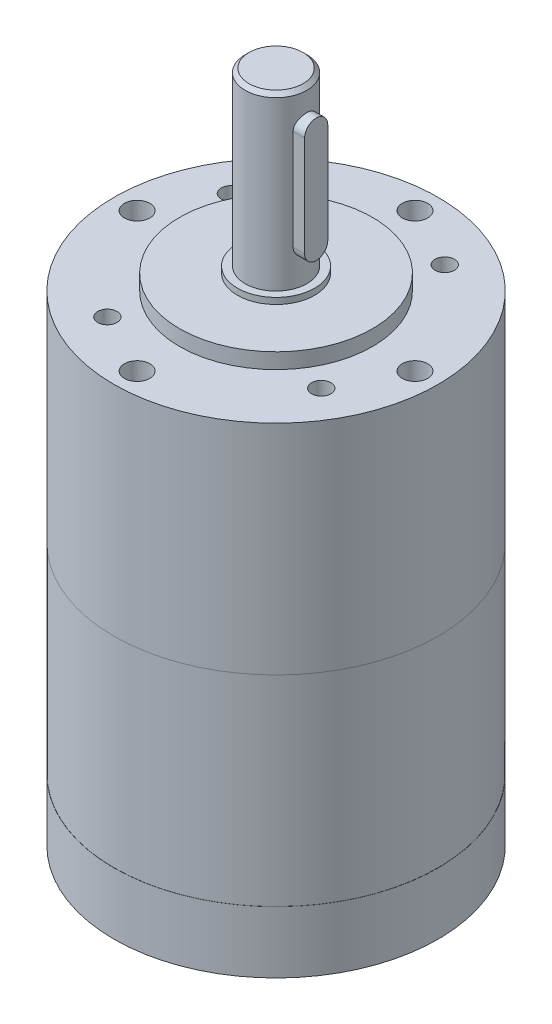
ISO-10303-21;
HEADER;
FILE_DESCRIPTION(('STEP AP214'),'2;1');
FILE_NAME('part.step','',(''),(''),'','','');
FILE_SCHEMA(('AUTOMOTIVE_DESIGN { 1 0 10303 214 1 1 1 1 }'));
ENDSEC;
DATA;
#1=APPLICATION_CONTEXT('core data for automotive mechanical design processes');
#2=APPLICATION_PROTOCOL_DEFINITION('international standard','automotive_design',2000,#1);
#3=PRODUCT_CONTEXT('',#1,'mechanical');
#4=PRODUCT('Part','Part','',(#3));
#5=PRODUCT_RELATED_PRODUCT_CATEGORY('part','',(#4));
#6=PRODUCT_DEFINITION_FORMATION('','',#4);
#7=PRODUCT_DEFINITION_CONTEXT('part definition',#1,'design');
#8=PRODUCT_DEFINITION('design','',#6,#7);
#9=PRODUCT_DEFINITION_SHAPE('','',#8);
#10=(LENGTH_UNIT() NAMED_UNIT(*) SI_UNIT(.MILLI.,.METRE.));
#11=(NAMED_UNIT(*) PLANE_ANGLE_UNIT() SI_UNIT($,.RADIAN.));
#12=(NAMED_UNIT(*) SI_UNIT($,.STERADIAN.) SOLID_ANGLE_UNIT());
#13=UNCERTAINTY_MEASURE_WITH_UNIT(LENGTH_MEASURE(1.E-05),#10,'distance_accuracy_value','');
#14=(GEOMETRIC_REPRESENTATION_CONTEXT(3) GLOBAL_UNCERTAINTY_ASSIGNED_CONTEXT((#13)) GLOBAL_UNIT_ASSIGNED_CONTEXT((#10,
#11,#12)) REPRESENTATION_CONTEXT('',''));
#15=CARTESIAN_POINT('',(0.,0.,0.));
#16=DIRECTION('',(0.,0.,1.));
#17=DIRECTION('',(1.,0.,0.));
#18=AXIS2_PLACEMENT_3D('',#15,#16,#17);
#19=CARTESIAN_POINT('',(5.2,69.7499999999999,0.));
#20=DIRECTION('',(-1.,0.,0.));
#21=DIRECTION('',(0.,0.,1.));
#22=AXIS2_PLACEMENT_3D('',#19,#20,#21);
#23=CYLINDRICAL_SURFACE('',#22,1.5);
#24=CARTESIAN_POINT('',(2.2,69.7499999999999,0.));
#25=DIRECTION('',(1.,0.,0.));
#26=DIRECTION('',(0.,0.,-1.));
#27=AXIS2_PLACEMENT_3D('',#24,#25,#26);
#28=CIRCLE('',#27,1.5);
#29=CARTESIAN_POINT('',(2.2,69.7499999999999,1.5));
#30=VERTEX_POINT('',#29);
#31=CARTESIAN_POINT('',(2.2,69.7499999999999,-1.5));
#32=VERTEX_POINT('',#31);
#33=EDGE_CURVE('E111',#30,#32,#28,.T.);
#34=ORIENTED_EDGE('',*,*,#33,.T.);
#35=DIRECTION('',(-1.,0.,0.));
#36=VECTOR('',#35,1.);
#37=CARTESIAN_POINT('',(5.2,69.7499999999999,-1.5));
#38=LINE('',#37,#36);
#39=CARTESIAN_POINT('',(5.2,69.7499999999999,-1.5));
#40=VERTEX_POINT('',#39);
#41=EDGE_CURVE('E12',#40,#32,#38,.T.);
#42=ORIENTED_EDGE('',*,*,#41,.F.);
#43=CARTESIAN_POINT('',(5.2,69.7499999999999,0.));
#44=DIRECTION('',(1.,0.,0.));
#45=DIRECTION('',(0.,0.,-1.));
#46=AXIS2_PLACEMENT_3D('',#43,#44,#45);
#47=CIRCLE('',#46,1.5);
#48=CARTESIAN_POINT('',(5.2,69.7499999999999,1.5));
#49=VERTEX_POINT('',#48);
#50=EDGE_CURVE('E99',#49,#40,#47,.T.);
#51=ORIENTED_EDGE('',*,*,#50,.F.);
#52=DIRECTION('',(-1.,0.,0.));
#53=VECTOR('',#52,1.);
#54=CARTESIAN_POINT('',(5.2,69.7499999999999,1.5));
#55=LINE('',#54,#53);
#56=EDGE_CURVE('E107',#49,#30,#55,.T.);
#57=ORIENTED_EDGE('',*,*,#56,.T.);
#58=EDGE_LOOP('',(#34,#42,#51,#57));
#59=FACE_BOUND('',#58,.T.);
#60=ADVANCED_FACE('F48',(#59),#23,.T.);
#61=CARTESIAN_POINT('',(5.2,69.7499999999999,-1.5));
#62=DIRECTION('',(0.,0.,1.));
#63=DIRECTION('',(1.,0.,0.));
#64=AXIS2_PLACEMENT_3D('',#61,#62,#63);
#65=PLANE('',#64);
#66=DIRECTION('',(0.,1.,0.));
#67=VECTOR('',#66,1.);
#68=CARTESIAN_POINT('',(2.2,69.7499999999999,-1.5));
#69=LINE('',#68,#67);
#70=CARTESIAN_POINT('',(2.2,82.7500000000001,-1.5));
#71=VERTEX_POINT('',#70);
#72=EDGE_CURVE('E103',#32,#71,#69,.T.);
#73=ORIENTED_EDGE('',*,*,#72,.T.);
#74=DIRECTION('',(-1.,0.,0.));
#75=VECTOR('',#74,1.);
#76=CARTESIAN_POINT('',(5.2,82.7500000000001,-1.5));
#77=LINE('',#76,#75);
#78=CARTESIAN_POINT('',(5.2,82.7500000000001,-1.5));
#79=VERTEX_POINT('',#78);
#80=EDGE_CURVE('E56',#79,#71,#77,.T.);
#81=ORIENTED_EDGE('',*,*,#80,.F.);
#82=DIRECTION('',(0.,1.,0.));
#83=VECTOR('',#82,1.);
#84=CARTESIAN_POINT('',(5.2,69.7499999999999,-1.5));
#85=LINE('',#84,#83);
#86=EDGE_CURVE('E94',#40,#79,#85,.T.);
#87=ORIENTED_EDGE('',*,*,#86,.F.);
#88=ORIENTED_EDGE('',*,*,#41,.T.);
#89=EDGE_LOOP('',(#73,#81,#87,#88));
#90=FACE_BOUND('',#89,.T.);
#91=ADVANCED_FACE('F102',(#90),#65,.F.);
#92=CARTESIAN_POINT('',(5.2,82.7500000000001,0.));
#93=DIRECTION('',(-1.,0.,0.));
#94=DIRECTION('',(0.,0.,1.));
#95=AXIS2_PLACEMENT_3D('',#92,#93,#94);
#96=CYLINDRICAL_SURFACE('',#95,1.5);
#97=CARTESIAN_POINT('',(2.2,82.7500000000001,0.));
#98=DIRECTION('',(1.,0.,0.));
#99=DIRECTION('',(0.,0.,-1.));
#100=AXIS2_PLACEMENT_3D('',#97,#98,#99);
#101=CIRCLE('',#100,1.5);
#102=CARTESIAN_POINT('',(2.2,82.7500000000001,1.5));
#103=VERTEX_POINT('',#102);
#104=EDGE_CURVE('E81',#71,#103,#101,.T.);
#105=ORIENTED_EDGE('',*,*,#104,.T.);
#106=DIRECTION('',(-1.,0.,0.));
#107=VECTOR('',#106,1.);
#108=CARTESIAN_POINT('',(5.2,82.7500000000001,1.5));
#109=LINE('',#108,#107);
#110=CARTESIAN_POINT('',(5.2,82.7500000000001,1.5));
#111=VERTEX_POINT('',#110);
#112=EDGE_CURVE('E104',#111,#103,#109,.T.);
#113=ORIENTED_EDGE('',*,*,#112,.F.);
#114=CARTESIAN_POINT('',(5.2,82.7500000000001,0.));
#115=DIRECTION('',(1.,0.,0.));
#116=DIRECTION('',(0.,0.,-1.));
#117=AXIS2_PLACEMENT_3D('',#114,#115,#116);
#118=CIRCLE('',#117,1.5);
#119=EDGE_CURVE('E97',#79,#111,#118,.T.);
#120=ORIENTED_EDGE('',*,*,#119,.F.);
#121=ORIENTED_EDGE('',*,*,#80,.T.);
#122=EDGE_LOOP('',(#105,#113,#120,#121));
#123=FACE_BOUND('',#122,.T.);
#124=ADVANCED_FACE('F105',(#123),#96,.T.);
#125=CARTESIAN_POINT('',(5.2,82.7500000000001,1.5));
#126=DIRECTION('',(0.,0.,-1.));
#127=DIRECTION('',(-1.,0.,0.));
#128=AXIS2_PLACEMENT_3D('',#125,#126,#127);
#129=PLANE('',#128);
#130=DIRECTION('',(0.,-1.,0.));
#131=VECTOR('',#130,1.);
#132=CARTESIAN_POINT('',(2.2,82.7500000000001,1.5));
#133=LINE('',#132,#131);
#134=EDGE_CURVE('E87',#103,#30,#133,.T.);
#135=ORIENTED_EDGE('',*,*,#134,.T.);
#136=ORIENTED_EDGE('',*,*,#56,.F.);
#137=DIRECTION('',(0.,-1.,0.));
#138=VECTOR('',#137,1.);
#139=CARTESIAN_POINT('',(5.2,82.7500000000001,1.5));
#140=LINE('',#139,#138);
#141=EDGE_CURVE('E64',#111,#49,#140,.T.);
#142=ORIENTED_EDGE('',*,*,#141,.F.);
#143=ORIENTED_EDGE('',*,*,#112,.T.);
#144=EDGE_LOOP('',(#135,#136,#142,#143));
#145=FACE_BOUND('',#144,.T.);
#146=ADVANCED_FACE('F118',(#145),#129,.F.);
#147=CARTESIAN_POINT('',(5.2,69.7499999999999,0.));
#148=DIRECTION('',(1.,0.,0.));
#149=DIRECTION('',(0.,0.,-1.));
#150=AXIS2_PLACEMENT_3D('',#147,#148,#149);
#151=PLANE('',#150);
#152=ORIENTED_EDGE('',*,*,#50,.T.);
#153=ORIENTED_EDGE('',*,*,#86,.T.);
#154=ORIENTED_EDGE('',*,*,#119,.T.);
#155=ORIENTED_EDGE('',*,*,#141,.T.);
#156=EDGE_LOOP('',(#152,#153,#154,#155));
#157=FACE_BOUND('',#156,.T.);
#158=ADVANCED_FACE('F95',(#157),#151,.T.);
#159=CARTESIAN_POINT('',(2.2,69.7499999999999,0.));
#160=DIRECTION('',(1.,0.,0.));
#161=DIRECTION('',(0.,0.,-1.));
#162=AXIS2_PLACEMENT_3D('',#159,#160,#161);
#163=PLANE('',#162);
#164=ORIENTED_EDGE('',*,*,#33,.F.);
#165=ORIENTED_EDGE('',*,*,#134,.F.);
#166=ORIENTED_EDGE('',*,*,#104,.F.);
#167=ORIENTED_EDGE('',*,*,#72,.F.);
#168=EDGE_LOOP('',(#164,#165,#166,#167));
#169=FACE_BOUND('',#168,.T.);
#170=ADVANCED_FACE('F121',(#169),#163,.F.);
#171=CLOSED_SHELL('',(#60,#91,#124,#146,#158,#170));
#172=MANIFOLD_SOLID_BREP('B2',#171);
#173=CARTESIAN_POINT('',(0.,99.8471123105966,0.));
#174=DIRECTION('',(0.,1.,0.));
#175=DIRECTION('',(0.,0.,1.));
#176=AXIS2_PLACEMENT_3D('',#173,#174,#175);
#177=CYLINDRICAL_SURFACE('',#176,4.);
#178=CARTESIAN_POINT('',(0.,86.75,0.));
#179=DIRECTION('',(0.,1.,0.));
#180=DIRECTION('',(0.,0.,1.));
#181=AXIS2_PLACEMENT_3D('',#178,#179,#180);
#182=CIRCLE('',#181,4.);
#183=CARTESIAN_POINT('',(0.,86.75,4.));
#184=VERTEX_POINT('',#183);
#185=EDGE_CURVE('E46',#184,#184,#182,.F.);
#186=ORIENTED_EDGE('',*,*,#185,.T.);
#187=EDGE_LOOP('',(#186));
#188=FACE_BOUND('',#187,.T.);
#189=CARTESIAN_POINT('',(0.,65.05,0.));
#190=DIRECTION('',(0.,1.,0.));
#191=DIRECTION('',(0.,0.,1.));
#192=AXIS2_PLACEMENT_3D('',#189,#190,#191);
#193=CIRCLE('',#192,4.);
#194=CARTESIAN_POINT('',(0.,65.05,4.));
#195=VERTEX_POINT('',#194);
#196=EDGE_CURVE('E317',#195,#195,#193,.T.);
#197=ORIENTED_EDGE('',*,*,#196,.T.);
#198=EDGE_LOOP('',(#197));
#199=FACE_BOUND('',#198,.T.);
#200=DIRECTION('',(0.,1.,0.));
#201=VECTOR('',#200,1.);
#202=CARTESIAN_POINT('',(3.70809924354783,99.8471123105966,-1.5));
#203=LINE('',#202,#201);
#204=CARTESIAN_POINT('',(3.70809924354783,82.7500000000001,-1.5));
#205=VERTEX_POINT('',#204);
#206=CARTESIAN_POINT('',(3.70809924354783,69.7499999999999,-1.5));
#207=VERTEX_POINT('',#206);
#208=EDGE_CURVE('E355',#205,#207,#203,.F.);
#209=ORIENTED_EDGE('',*,*,#208,.T.);
#210=CARTESIAN_POINT('',(3.70809924354783,69.7499999999999,-1.5));
#211=CARTESIAN_POINT('',(3.70809443619347,69.7094074669703,-1.50000149729856));
#212=CARTESIAN_POINT('',(3.70876663375751,69.6688360707121,-1.49835118206537));
#213=CARTESIAN_POINT('',(3.71141673218275,69.5880154612726,-1.49177905295192));
#214=CARTESIAN_POINT('',(3.7133941946446,69.5477661445067,-1.48685833749724));
#215=CARTESIAN_POINT('',(3.72118975606221,69.4282327842747,-1.46729482367935));
#216=CARTESIAN_POINT('',(3.72887188404209,69.3498003397727,-1.44784998767984));
#217=CARTESIAN_POINT('',(3.74825217997877,69.1976324814848,-1.39690233043372));
#218=CARTESIAN_POINT('',(3.7599469632381,69.1238931709591,-1.36540966903062));
#219=CARTESIAN_POINT('',(3.7860238820009,68.9826664799386,-1.29134097725473));
#220=CARTESIAN_POINT('',(3.80040821426565,68.9151842779875,-1.24875587557702));
#221=CARTESIAN_POINT('',(3.83103589828726,68.7851080800592,-1.15146603872017));
#222=CARTESIAN_POINT('',(3.84733374054252,68.7228699856817,-1.09630269892844));
#223=CARTESIAN_POINT('',(3.8794978206844,68.6082764069825,-0.976394584974262));
#224=CARTESIAN_POINT('',(3.8953639745168,68.5559228356595,-0.911647960429705));
#225=CARTESIAN_POINT('',(3.92552893891844,68.4608597857463,-0.771693719740038));
#226=CARTESIAN_POINT('',(3.93975598379754,68.4185393993162,-0.696204968758629));
#227=CARTESIAN_POINT('',(3.96438035322527,68.347348088917,-0.538553622304924));
#228=CARTESIAN_POINT('',(3.97477910532575,68.318472150513,-0.456393528521805));
#229=CARTESIAN_POINT('',(3.99018690464435,68.2762422811783,-0.291490050670587));
#230=CARTESIAN_POINT('',(3.99540906103972,68.2622726156959,-0.208924649211909));
#231=CARTESIAN_POINT('',(4.00064014015321,68.2482788020679,-0.042465838580888));
#232=CARTESIAN_POINT('',(4.00065066686691,68.248250363198,0.0414271540462095));
#233=CARTESIAN_POINT('',(3.99559264174045,68.2617818062289,0.203744100069408));
#234=CARTESIAN_POINT('',(3.99077535168083,68.2746694752073,0.282233282883085));
#235=CARTESIAN_POINT('',(3.97693262269583,68.3125362711121,0.435840275995116));
#236=CARTESIAN_POINT('',(3.96790694481372,68.3375160846462,0.510957894586929));
#237=CARTESIAN_POINT('',(3.94637770601049,68.3991703925957,0.656988917196578));
#238=CARTESIAN_POINT('',(3.93382542785068,68.4360098409233,0.727825198012184));
#239=CARTESIAN_POINT('',(3.90651314175191,68.520192037573,0.86248644437507));
#240=CARTESIAN_POINT('',(3.89175241632298,68.5675382017872,0.92630911958009));
#241=CARTESIAN_POINT('',(3.86052643048222,68.674623131491,1.04908600084313));
#242=CARTESIAN_POINT('',(3.84401196825707,68.7349243843349,1.10753779261244));
#243=CARTESIAN_POINT('',(3.81182684214318,68.8645841343777,1.21369725159035));
#244=CARTESIAN_POINT('',(3.79615651174147,68.9339461746473,1.26140069584828));
#245=CARTESIAN_POINT('',(3.7671186794103,69.0817580284137,1.34567998313248));
#246=CARTESIAN_POINT('',(3.75381153298453,69.1603784056675,1.38197861969245));
#247=CARTESIAN_POINT('',(3.73171449181344,69.3232063218418,1.44059114536973));
#248=CARTESIAN_POINT('',(3.72291700934123,69.4074042049328,1.46292853893353));
#249=CARTESIAN_POINT('',(3.7140622685257,69.5353810176477,1.48519272209728));
#250=CARTESIAN_POINT('',(3.71183476402566,69.5781023295205,1.49074028414002));
#251=CARTESIAN_POINT('',(3.70885093143242,69.6638740688716,1.49814308997677));
#252=CARTESIAN_POINT('',(3.70809323601798,69.7069241530293,1.50000176547338));
#253=CARTESIAN_POINT('',(3.70809924354783,69.7499999999999,1.5));
#254=B_SPLINE_CURVE_WITH_KNOTS('',3,(#210,#211,#212,#213,#214,#215,#216,#217,#218,#219,#220,
#221,#222,#223,#224,#225,#226,#227,#228,#229,#230,#231,#232,#233,#234,#235,#236,#237,#238,#239,
#240,#241,#242,#243,#244,#245,#246,#247,#248,#249,#250,#251,#252,#253),.UNSPECIFIED.,.F.,.F.,(4,
2,2,2,2,2,2,2,2,2,2,2,2,2,2,2,2,2,2,2,2,4),(0.,0.121697465666171,0.243354077586409,
0.485593064591345,0.727628221922028,0.969861938431276,1.22298027419406,1.47614754705134,
1.73793539440997,1.9996255232324,2.25002925199203,2.50035591335681,2.73829765644059,
2.97625291175452,3.21767225141683,3.45917019544674,3.71477993951631,3.97048993642582,
4.23200510445916,4.4930788043249,4.62233004062783,4.75146098044212),.UNSPECIFIED.);
#255=CARTESIAN_POINT('',(3.70809924354783,69.7499999999999,1.5));
#256=VERTEX_POINT('',#255);
#257=EDGE_CURVE('E194',#207,#256,#254,.T.);
#258=ORIENTED_EDGE('',*,*,#257,.T.);
#259=DIRECTION('',(0.,1.,0.));
#260=VECTOR('',#259,1.);
#261=CARTESIAN_POINT('',(3.70809924354783,99.8471123105966,1.5));
#262=LINE('',#261,#260);
#263=CARTESIAN_POINT('',(3.70809924354783,82.7500000000001,1.5));
#264=VERTEX_POINT('',#263);
#265=EDGE_CURVE('E344',#256,#264,#262,.T.);
#266=ORIENTED_EDGE('',*,*,#265,.T.);
#267=CARTESIAN_POINT('',(3.70809924354783,82.7500000000001,1.5));
#268=CARTESIAN_POINT('',(3.70809443619347,82.7905925330297,1.50000149729856));
#269=CARTESIAN_POINT('',(3.70876663375751,82.8311639292879,1.49835118206537));
#270=CARTESIAN_POINT('',(3.71141673218274,82.9119845387275,1.49177905295193));
#271=CARTESIAN_POINT('',(3.7133941946446,82.9522338554933,1.48685833749724));
#272=CARTESIAN_POINT('',(3.72118975606221,83.0717672157254,1.46729482367935));
#273=CARTESIAN_POINT('',(3.72887188404209,83.1501996602273,1.44784998767984));
#274=CARTESIAN_POINT('',(3.74825217997877,83.3023675185152,1.39690233043373));
#275=CARTESIAN_POINT('',(3.7599469632381,83.3761068290409,1.36540966903062));
#276=CARTESIAN_POINT('',(3.7860238820009,83.5173335200615,1.29134097725474));
#277=CARTESIAN_POINT('',(3.80040821426565,83.5848157220126,1.24875587557703));
#278=CARTESIAN_POINT('',(3.83103589828726,83.7148919199408,1.15146603872017));
#279=CARTESIAN_POINT('',(3.84733374054252,83.7771300143183,1.09630269892844));
#280=CARTESIAN_POINT('',(3.8794978206844,83.8917235930176,0.976394584974261));
#281=CARTESIAN_POINT('',(3.8953639745168,83.9440771643405,0.911647960429708));
#282=CARTESIAN_POINT('',(3.92552893891844,84.0391402142538,0.771693719740046));
#283=CARTESIAN_POINT('',(3.93975598379754,84.0814606006838,0.696204968758639));
#284=CARTESIAN_POINT('',(3.96438035322527,84.152651911083,0.53855362230494));
#285=CARTESIAN_POINT('',(3.97477910532575,84.181527849487,0.456393528521824));
#286=CARTESIAN_POINT('',(3.99018690464435,84.2237577188217,0.29149005067061));
#287=CARTESIAN_POINT('',(3.99540906103972,84.2377273843041,0.208924649211931));
#288=CARTESIAN_POINT('',(4.00064014015321,84.2517211979322,0.0424658385809082));
#289=CARTESIAN_POINT('',(4.00065066686691,84.2517496368021,-0.041427154046191));
#290=CARTESIAN_POINT('',(3.99559264174045,84.2382181937712,-0.20374410006939));
#291=CARTESIAN_POINT('',(3.99077535168083,84.2253305247927,-0.282233282883067));
#292=CARTESIAN_POINT('',(3.97693262269583,84.187463728888,-0.435840275995101));
#293=CARTESIAN_POINT('',(3.96790694481372,84.1624839153538,-0.510957894586917));
#294=CARTESIAN_POINT('',(3.94637770601049,84.1008296074044,-0.656988917196564));
#295=CARTESIAN_POINT('',(3.93382542785069,84.0639901590767,-0.727825198012166));
#296=CARTESIAN_POINT('',(3.90651314175191,83.979807962427,-0.862486444375051));
#297=CARTESIAN_POINT('',(3.89175241632298,83.9324617982128,-0.926309119580074));
#298=CARTESIAN_POINT('',(3.86052643048223,83.825376868509,-1.04908600084311));
#299=CARTESIAN_POINT('',(3.84401196825707,83.7650756156652,-1.10753779261243));
#300=CARTESIAN_POINT('',(3.81182684214318,83.6354158656224,-1.21369725159034));
#301=CARTESIAN_POINT('',(3.79615651174147,83.5660538253527,-1.26140069584827));
#302=CARTESIAN_POINT('',(3.7671186794103,83.4182419715864,-1.34567998313247));
#303=CARTESIAN_POINT('',(3.75381153298453,83.3396215943325,-1.38197861969244));
#304=CARTESIAN_POINT('',(3.73171449181344,83.1767936781583,-1.44059114536972));
#305=CARTESIAN_POINT('',(3.72291700934124,83.0925957950672,-1.46292853893352));
#306=CARTESIAN_POINT('',(3.7140622685257,82.9646189823524,-1.48519272209728));
#307=CARTESIAN_POINT('',(3.71183476402566,82.9218976704796,-1.49074028414002));
#308=CARTESIAN_POINT('',(3.70885093143242,82.8361259311284,-1.49814308997677));
#309=CARTESIAN_POINT('',(3.70809323601798,82.7930758469707,-1.50000176547338));
#310=CARTESIAN_POINT('',(3.70809924354783,82.7500000000001,-1.5));
#311=B_SPLINE_CURVE_WITH_KNOTS('',3,(#267,#268,#269,#270,#271,#272,#273,#274,#275,#276,#277,
#278,#279,#280,#281,#282,#283,#284,#285,#286,#287,#288,#289,#290,#291,#292,#293,#294,#295,#296,
#297,#298,#299,#300,#301,#302,#303,#304,#305,#306,#307,#308,#309,#310),.UNSPECIFIED.,.F.,.F.,(4,
2,2,2,2,2,2,2,2,2,2,2,2,2,2,2,2,2,2,2,2,4),(0.,0.121697465666171,0.243354077586409,
0.485593064591344,0.727628221922026,0.96986193843129,1.22298027419407,1.47614754705135,
1.73793539440997,1.99962552323239,2.25002925199202,2.5003559133568,2.73829765644058,
2.97625291175452,3.21767225141682,3.45917019544673,3.7147799395163,3.97048993642582,
4.23200510445912,4.49307880432489,4.62233004062785,4.75146098044216),.UNSPECIFIED.);
#312=EDGE_CURVE('E347',#264,#205,#311,.T.);
#313=ORIENTED_EDGE('',*,*,#312,.T.);
#314=EDGE_LOOP('',(#209,#258,#266,#313));
#315=FACE_BOUND('',#314,.T.);
#316=ADVANCED_FACE('F171',(#188,#199,#315),#177,.T.);
#317=CARTESIAN_POINT('',(0.,8.,0.));
#318=DIRECTION('',(0.,1.,0.));
#319=DIRECTION('',(0.,0.,1.));
#320=AXIS2_PLACEMENT_3D('',#317,#318,#319);
#321=PLANE('',#320);
#322=CARTESIAN_POINT('',(0.,8.00000000000001,0.));
#323=DIRECTION('',(0.,1.,0.));
#324=DIRECTION('',(0.,0.,1.));
#325=AXIS2_PLACEMENT_3D('',#322,#323,#324);
#326=CIRCLE('',#325,21.);
#327=CARTESIAN_POINT('',(0.,8.00000000000001,21.));
#328=VERTEX_POINT('',#327);
#329=EDGE_CURVE('E311',#328,#328,#326,.T.);
#330=ORIENTED_EDGE('',*,*,#329,.T.);
#331=EDGE_LOOP('',(#330));
#332=FACE_BOUND('',#331,.T.);
#333=CARTESIAN_POINT('',(0.,8.00000000000001,0.));
#334=DIRECTION('',(0.,1.,0.));
#335=DIRECTION('',(0.,0.,1.));
#336=AXIS2_PLACEMENT_3D('',#333,#334,#335);
#337=CIRCLE('',#336,20.98);
#338=CARTESIAN_POINT('',(0.,8.00000000000001,20.98));
#339=VERTEX_POINT('',#338);
#340=EDGE_CURVE('E341',#339,#339,#337,.T.);
#341=ORIENTED_EDGE('',*,*,#340,.F.);
#342=EDGE_LOOP('',(#341));
#343=FACE_BOUND('',#342,.T.);
#344=ADVANCED_FACE('F400',(#332,#343),#321,.T.);
#345=CARTESIAN_POINT('',(0.,99.8471123105966,0.));
#346=DIRECTION('',(0.,1.,0.));
#347=DIRECTION('',(0.,0.,1.));
#348=AXIS2_PLACEMENT_3D('',#345,#346,#347);
#349=CYLINDRICAL_SURFACE('',#348,20.98);
#350=ORIENTED_EDGE('',*,*,#340,.T.);
#351=EDGE_LOOP('',(#350));
#352=FACE_BOUND('',#351,.T.);
#353=CARTESIAN_POINT('',(0.,34.,0.));
#354=DIRECTION('',(0.,1.,0.));
#355=DIRECTION('',(0.,0.,1.));
#356=AXIS2_PLACEMENT_3D('',#353,#354,#355);
#357=CIRCLE('',#356,20.98);
#358=CARTESIAN_POINT('',(0.,34.,20.98));
#359=VERTEX_POINT('',#358);
#360=EDGE_CURVE('E338',#359,#359,#357,.T.);
#361=ORIENTED_EDGE('',*,*,#360,.F.);
#362=EDGE_LOOP('',(#361));
#363=FACE_BOUND('',#362,.T.);
#364=ADVANCED_FACE('F405',(#352,#363),#349,.T.);
#365=CARTESIAN_POINT('',(0.,34.,0.));
#366=DIRECTION('',(0.,-1.,0.));
#367=DIRECTION('',(0.,0.,-1.));
#368=AXIS2_PLACEMENT_3D('',#365,#366,#367);
#369=PLANE('',#368);
#370=ORIENTED_EDGE('',*,*,#360,.T.);
#371=EDGE_LOOP('',(#370));
#372=FACE_BOUND('',#371,.T.);
#373=CARTESIAN_POINT('',(0.,34.,0.));
#374=DIRECTION('',(0.,1.,0.));
#375=DIRECTION('',(0.,0.,1.));
#376=AXIS2_PLACEMENT_3D('',#373,#374,#375);
#377=CIRCLE('',#376,21.);
#378=CARTESIAN_POINT('',(0.,34.,21.));
#379=VERTEX_POINT('',#378);
#380=EDGE_CURVE('E335',#379,#379,#377,.T.);
#381=ORIENTED_EDGE('',*,*,#380,.F.);
#382=EDGE_LOOP('',(#381));
#383=FACE_BOUND('',#382,.T.);
#384=ADVANCED_FACE('F666',(#372,#383),#369,.T.);
#385=CARTESIAN_POINT('',(0.,99.8471123105966,0.));
#386=DIRECTION('',(0.,1.,0.));
#387=DIRECTION('',(0.,0.,1.));
#388=AXIS2_PLACEMENT_3D('',#385,#386,#387);
#389=CYLINDRICAL_SURFACE('',#388,21.);
#390=ORIENTED_EDGE('',*,*,#380,.T.);
#391=EDGE_LOOP('',(#390));
#392=FACE_BOUND('',#391,.T.);
#393=CARTESIAN_POINT('',(0.,62.25,0.));
#394=DIRECTION('',(0.,1.,0.));
#395=DIRECTION('',(0.,0.,1.));
#396=AXIS2_PLACEMENT_3D('',#393,#394,#395);
#397=CIRCLE('',#396,21.);
#398=CARTESIAN_POINT('',(0.,62.25,21.));
#399=VERTEX_POINT('',#398);
#400=EDGE_CURVE('E332',#399,#399,#397,.T.);
#401=ORIENTED_EDGE('',*,*,#400,.F.);
#402=EDGE_LOOP('',(#401));
#403=FACE_BOUND('',#402,.T.);
#404=ADVANCED_FACE('F541',(#392,#403),#389,.T.);
#405=CARTESIAN_POINT('',(1.01634387180759E-13,62.25,0.));
#406=DIRECTION('',(0.,1.,0.));
#407=DIRECTION('',(0.,0.,1.));
#408=AXIS2_PLACEMENT_3D('',#405,#406,#407);
#409=PLANE('',#408);
#410=CARTESIAN_POINT('',(18.,62.25,0.));
#411=DIRECTION('',(0.,1.,0.));
#412=DIRECTION('',(0.,0.,1.));
#413=AXIS2_PLACEMENT_3D('',#410,#411,#412);
#414=CIRCLE('',#413,1.65);
#415=CARTESIAN_POINT('',(18.,62.25,1.65));
#416=VERTEX_POINT('',#415);
#417=EDGE_CURVE('E246',#416,#416,#414,.T.);
#418=ORIENTED_EDGE('',*,*,#417,.F.);
#419=EDGE_LOOP('',(#418));
#420=FACE_BOUND('',#419,.T.);
#421=CARTESIAN_POINT('',(0.,62.25,18.));
#422=DIRECTION('',(0.,1.,0.));
#423=DIRECTION('',(0.,0.,1.));
#424=AXIS2_PLACEMENT_3D('',#421,#422,#423);
#425=CIRCLE('',#424,1.65);
#426=CARTESIAN_POINT('',(0.,62.25,19.65));
#427=VERTEX_POINT('',#426);
#428=EDGE_CURVE('E245',#427,#427,#425,.T.);
#429=ORIENTED_EDGE('',*,*,#428,.F.);
#430=EDGE_LOOP('',(#429));
#431=FACE_BOUND('',#430,.T.);
#432=CARTESIAN_POINT('',(-18.,62.25,0.));
#433=DIRECTION('',(0.,1.,0.));
#434=DIRECTION('',(0.,0.,1.));
#435=AXIS2_PLACEMENT_3D('',#432,#433,#434);
#436=CIRCLE('',#435,1.65);
#437=CARTESIAN_POINT('',(-18.,62.25,1.65));
#438=VERTEX_POINT('',#437);
#439=EDGE_CURVE('E256',#438,#438,#436,.T.);
#440=ORIENTED_EDGE('',*,*,#439,.F.);
#441=EDGE_LOOP('',(#440));
#442=FACE_BOUND('',#441,.T.);
#443=CARTESIAN_POINT('',(0.,62.25,-18.));
#444=DIRECTION('',(0.,1.,0.));
#445=DIRECTION('',(0.,0.,1.));
#446=AXIS2_PLACEMENT_3D('',#443,#444,#445);
#447=CIRCLE('',#446,1.65);
#448=CARTESIAN_POINT('',(0.,62.25,-16.35));
#449=VERTEX_POINT('',#448);
#450=EDGE_CURVE('E262',#449,#449,#447,.T.);
#451=ORIENTED_EDGE('',*,*,#450,.F.);
#452=EDGE_LOOP('',(#451));
#453=FACE_BOUND('',#452,.T.);
#454=CARTESIAN_POINT('',(13.8564064605511,62.25,7.99999999999991));
#455=DIRECTION('',(0.,1.,0.));
#456=DIRECTION('',(0.,0.,1.));
#457=AXIS2_PLACEMENT_3D('',#454,#455,#456);
#458=CIRCLE('',#457,1.24999999999999);
#459=CARTESIAN_POINT('',(13.8564064605511,62.25,9.2499999999999));
#460=VERTEX_POINT('',#459);
#461=EDGE_CURVE('E268',#460,#460,#458,.T.);
#462=ORIENTED_EDGE('',*,*,#461,.F.);
#463=EDGE_LOOP('',(#462));
#464=FACE_BOUND('',#463,.T.);
#465=CARTESIAN_POINT('',(7.99999999999991,62.25,-13.8564064605511));
#466=DIRECTION('',(0.,1.,0.));
#467=DIRECTION('',(0.,0.,1.));
#468=AXIS2_PLACEMENT_3D('',#465,#466,#467);
#469=CIRCLE('',#468,1.24999999999999);
#470=CARTESIAN_POINT('',(7.99999999999991,62.25,-12.6064064605511));
#471=VERTEX_POINT('',#470);
#472=EDGE_CURVE('E274',#471,#471,#469,.T.);
#473=ORIENTED_EDGE('',*,*,#472,.F.);
#474=EDGE_LOOP('',(#473));
#475=FACE_BOUND('',#474,.T.);
#476=CARTESIAN_POINT('',(-7.99999999999991,62.25,13.8564064605511));
#477=DIRECTION('',(0.,1.,0.));
#478=DIRECTION('',(0.,0.,1.));
#479=AXIS2_PLACEMENT_3D('',#476,#477,#478);
#480=CIRCLE('',#479,1.24999999999999);
#481=CARTESIAN_POINT('',(-7.99999999999991,62.25,15.1064064605511));
#482=VERTEX_POINT('',#481);
#483=EDGE_CURVE('E280',#482,#482,#480,.T.);
#484=ORIENTED_EDGE('',*,*,#483,.F.);
#485=EDGE_LOOP('',(#484));
#486=FACE_BOUND('',#485,.T.);
#487=CARTESIAN_POINT('',(-13.8564064605511,62.25,-7.99999999999991));
#488=DIRECTION('',(0.,1.,0.));
#489=DIRECTION('',(0.,0.,1.));
#490=AXIS2_PLACEMENT_3D('',#487,#488,#489);
#491=CIRCLE('',#490,1.24999999999999);
#492=CARTESIAN_POINT('',(-13.8564064605511,62.25,-6.74999999999992));
#493=VERTEX_POINT('',#492);
#494=EDGE_CURVE('E286',#493,#493,#491,.T.);
#495=ORIENTED_EDGE('',*,*,#494,.F.);
#496=EDGE_LOOP('',(#495));
#497=FACE_BOUND('',#496,.T.);
#498=ORIENTED_EDGE('',*,*,#400,.T.);
#499=EDGE_LOOP('',(#498));
#500=FACE_BOUND('',#499,.T.);
#501=CARTESIAN_POINT('',(0.,62.25,0.));
#502=DIRECTION('',(0.,1.,0.));
#503=DIRECTION('',(0.,0.,1.));
#504=AXIS2_PLACEMENT_3D('',#501,#502,#503);
#505=CIRCLE('',#504,12.5);
#506=CARTESIAN_POINT('',(0.,62.25,12.5));
#507=VERTEX_POINT('',#506);
#508=EDGE_CURVE('E329',#507,#507,#505,.T.);
#509=ORIENTED_EDGE('',*,*,#508,.F.);
#510=EDGE_LOOP('',(#509));
#511=FACE_BOUND('',#510,.T.);
#512=ADVANCED_FACE('F535',(#420,#431,#442,#453,#464,#475,#486,#497,#500,#511),#409,.T.);
#513=CARTESIAN_POINT('',(0.,99.8471123105966,0.));
#514=DIRECTION('',(0.,1.,0.));
#515=DIRECTION('',(0.,0.,1.));
#516=AXIS2_PLACEMENT_3D('',#513,#514,#515);
#517=CYLINDRICAL_SURFACE('',#516,12.5);
#518=ORIENTED_EDGE('',*,*,#508,.T.);
#519=EDGE_LOOP('',(#518));
#520=FACE_BOUND('',#519,.T.);
#521=CARTESIAN_POINT('',(0.,64.25,0.));
#522=DIRECTION('',(0.,1.,0.));
#523=DIRECTION('',(0.,0.,1.));
#524=AXIS2_PLACEMENT_3D('',#521,#522,#523);
#525=CIRCLE('',#524,12.5);
#526=CARTESIAN_POINT('',(0.,64.25,12.5));
#527=VERTEX_POINT('',#526);
#528=EDGE_CURVE('E326',#527,#527,#525,.T.);
#529=ORIENTED_EDGE('',*,*,#528,.F.);
#530=EDGE_LOOP('',(#529));
#531=FACE_BOUND('',#530,.T.);
#532=ADVANCED_FACE('F540',(#520,#531),#517,.T.);
#533=CARTESIAN_POINT('',(0.,64.25,0.));
#534=DIRECTION('',(0.,1.,0.));
#535=DIRECTION('',(0.,0.,1.));
#536=AXIS2_PLACEMENT_3D('',#533,#534,#535);
#537=PLANE('',#536);
#538=ORIENTED_EDGE('',*,*,#528,.T.);
#539=EDGE_LOOP('',(#538));
#540=FACE_BOUND('',#539,.T.);
#541=CARTESIAN_POINT('',(0.,64.25,0.));
#542=DIRECTION('',(0.,1.,0.));
#543=DIRECTION('',(0.,0.,1.));
#544=AXIS2_PLACEMENT_3D('',#541,#542,#543);
#545=CIRCLE('',#544,5.);
#546=CARTESIAN_POINT('',(0.,64.25,5.));
#547=VERTEX_POINT('',#546);
#548=EDGE_CURVE('E323',#547,#547,#545,.T.);
#549=ORIENTED_EDGE('',*,*,#548,.F.);
#550=EDGE_LOOP('',(#549));
#551=FACE_BOUND('',#550,.T.);
#552=ADVANCED_FACE('F647',(#540,#551),#537,.T.);
#553=CARTESIAN_POINT('',(0.,99.8471123105966,0.));
#554=DIRECTION('',(0.,1.,0.));
#555=DIRECTION('',(0.,0.,1.));
#556=AXIS2_PLACEMENT_3D('',#553,#554,#555);
#557=CYLINDRICAL_SURFACE('',#556,5.);
#558=ORIENTED_EDGE('',*,*,#548,.T.);
#559=EDGE_LOOP('',(#558));
#560=FACE_BOUND('',#559,.T.);
#561=CARTESIAN_POINT('',(0.,65.05,0.));
#562=DIRECTION('',(0.,1.,0.));
#563=DIRECTION('',(0.,0.,1.));
#564=AXIS2_PLACEMENT_3D('',#561,#562,#563);
#565=CIRCLE('',#564,5.);
#566=CARTESIAN_POINT('',(0.,65.05,5.));
#567=VERTEX_POINT('',#566);
#568=EDGE_CURVE('E320',#567,#567,#565,.T.);
#569=ORIENTED_EDGE('',*,*,#568,.F.);
#570=EDGE_LOOP('',(#569));
#571=FACE_BOUND('',#570,.T.);
#572=ADVANCED_FACE('F653',(#560,#571),#557,.T.);
#573=CARTESIAN_POINT('',(0.,65.05,0.));
#574=DIRECTION('',(0.,1.,0.));
#575=DIRECTION('',(0.,0.,1.));
#576=AXIS2_PLACEMENT_3D('',#573,#574,#575);
#577=PLANE('',#576);
#578=ORIENTED_EDGE('',*,*,#568,.T.);
#579=EDGE_LOOP('',(#578));
#580=FACE_BOUND('',#579,.T.);
#581=ORIENTED_EDGE('',*,*,#196,.F.);
#582=EDGE_LOOP('',(#581));
#583=FACE_BOUND('',#582,.T.);
#584=ADVANCED_FACE('F440',(#580,#583),#577,.T.);
#585=CARTESIAN_POINT('',(0.,87.25,0.));
#586=DIRECTION('',(0.,1.,0.));
#587=DIRECTION('',(0.,0.,1.));
#588=AXIS2_PLACEMENT_3D('',#585,#586,#587);
#589=PLANE('',#588);
#590=CARTESIAN_POINT('',(0.,87.25,0.));
#591=DIRECTION('',(0.,1.,0.));
#592=DIRECTION('',(0.,0.,1.));
#593=AXIS2_PLACEMENT_3D('',#590,#591,#592);
#594=CIRCLE('',#593,3.49999999999999);
#595=CARTESIAN_POINT('',(0.,87.25,3.49999999999999));
#596=VERTEX_POINT('',#595);
#597=EDGE_CURVE('E179',#596,#596,#594,.T.);
#598=ORIENTED_EDGE('',*,*,#597,.T.);
#599=EDGE_LOOP('',(#598));
#600=FACE_BOUND('',#599,.T.);
#601=ADVANCED_FACE('F384',(#600),#589,.T.);
#602=CARTESIAN_POINT('',(0.,0.,0.));
#603=DIRECTION('',(0.,-1.,0.));
#604=DIRECTION('',(0.,0.,-1.));
#605=AXIS2_PLACEMENT_3D('',#602,#603,#604);
#606=PLANE('',#605);
#607=CARTESIAN_POINT('',(0.,0.,0.));
#608=DIRECTION('',(0.,1.,0.));
#609=DIRECTION('',(0.,0.,1.));
#610=AXIS2_PLACEMENT_3D('',#607,#608,#609);
#611=CIRCLE('',#610,21.);
#612=CARTESIAN_POINT('',(0.,0.,21.));
#613=VERTEX_POINT('',#612);
#614=EDGE_CURVE('E314',#613,#613,#611,.T.);
#615=ORIENTED_EDGE('',*,*,#614,.F.);
#616=EDGE_LOOP('',(#615));
#617=FACE_BOUND('',#616,.T.);
#618=ADVANCED_FACE('F439',(#617),#606,.T.);
#619=ORIENTED_EDGE('',*,*,#614,.T.);
#620=EDGE_LOOP('',(#619));
#621=FACE_BOUND('',#620,.T.);
#622=ORIENTED_EDGE('',*,*,#329,.F.);
#623=EDGE_LOOP('',(#622));
#624=FACE_BOUND('',#623,.T.);
#625=ADVANCED_FACE('F376',(#621,#624),#389,.T.);
#626=CARTESIAN_POINT('',(21.,69.7499999999999,0.));
#627=DIRECTION('',(-1.,0.,0.));
#628=DIRECTION('',(0.,0.,1.));
#629=AXIS2_PLACEMENT_3D('',#626,#627,#628);
#630=CYLINDRICAL_SURFACE('',#629,1.5);
#631=DIRECTION('',(-1.,0.,0.));
#632=VECTOR('',#631,1.);
#633=CARTESIAN_POINT('',(21.,69.7499999999999,-1.5));
#634=LINE('',#633,#632);
#635=CARTESIAN_POINT('',(2.2,69.7499999999999,-1.5));
#636=VERTEX_POINT('',#635);
#637=EDGE_CURVE('E309',#207,#636,#634,.T.);
#638=ORIENTED_EDGE('',*,*,#637,.T.);
#639=CARTESIAN_POINT('',(2.2,69.7499999999999,0.));
#640=DIRECTION('',(1.,0.,0.));
#641=DIRECTION('',(0.,0.,-1.));
#642=AXIS2_PLACEMENT_3D('',#639,#640,#641);
#643=CIRCLE('',#642,1.5);
#644=CARTESIAN_POINT('',(2.2,69.7499999999999,1.5));
#645=VERTEX_POINT('',#644);
#646=EDGE_CURVE('E292',#645,#636,#643,.T.);
#647=ORIENTED_EDGE('',*,*,#646,.F.);
#648=DIRECTION('',(-1.,0.,0.));
#649=VECTOR('',#648,1.);
#650=CARTESIAN_POINT('',(21.,69.7499999999999,1.5));
#651=LINE('',#650,#649);
#652=EDGE_CURVE('E304',#256,#645,#651,.T.);
#653=ORIENTED_EDGE('',*,*,#652,.F.);
#654=ORIENTED_EDGE('',*,*,#257,.F.);
#655=EDGE_LOOP('',(#638,#647,#653,#654));
#656=FACE_BOUND('',#655,.T.);
#657=ADVANCED_FACE('F371',(#656),#630,.F.);
#658=CARTESIAN_POINT('',(21.,69.7499999999999,-1.5));
#659=DIRECTION('',(0.,0.,1.));
#660=DIRECTION('',(1.,0.,0.));
#661=AXIS2_PLACEMENT_3D('',#658,#659,#660);
#662=PLANE('',#661);
#663=DIRECTION('',(-1.,0.,0.));
#664=VECTOR('',#663,1.);
#665=CARTESIAN_POINT('',(21.,82.7500000000001,-1.5));
#666=LINE('',#665,#664);
#667=CARTESIAN_POINT('',(2.2,82.7500000000001,-1.5));
#668=VERTEX_POINT('',#667);
#669=EDGE_CURVE('E307',#205,#668,#666,.T.);
#670=ORIENTED_EDGE('',*,*,#669,.T.);
#671=DIRECTION('',(0.,1.,0.));
#672=VECTOR('',#671,1.);
#673=CARTESIAN_POINT('',(2.2,69.7499999999999,-1.5));
#674=LINE('',#673,#672);
#675=EDGE_CURVE('E295',#636,#668,#674,.T.);
#676=ORIENTED_EDGE('',*,*,#675,.F.);
#677=ORIENTED_EDGE('',*,*,#637,.F.);
#678=ORIENTED_EDGE('',*,*,#208,.F.);
#679=EDGE_LOOP('',(#670,#676,#677,#678));
#680=FACE_BOUND('',#679,.T.);
#681=ADVANCED_FACE('F366',(#680),#662,.T.);
#682=CARTESIAN_POINT('',(21.,82.7500000000001,0.));
#683=DIRECTION('',(-1.,0.,0.));
#684=DIRECTION('',(0.,0.,1.));
#685=AXIS2_PLACEMENT_3D('',#682,#683,#684);
#686=CYLINDRICAL_SURFACE('',#685,1.5);
#687=DIRECTION('',(-1.,0.,0.));
#688=VECTOR('',#687,1.);
#689=CARTESIAN_POINT('',(21.,82.7500000000001,1.5));
#690=LINE('',#689,#688);
#691=CARTESIAN_POINT('',(2.2,82.7500000000001,1.5));
#692=VERTEX_POINT('',#691);
#693=EDGE_CURVE('E186',#264,#692,#690,.T.);
#694=ORIENTED_EDGE('',*,*,#693,.T.);
#695=CARTESIAN_POINT('',(2.2,82.7500000000001,0.));
#696=DIRECTION('',(1.,0.,0.));
#697=DIRECTION('',(0.,0.,-1.));
#698=AXIS2_PLACEMENT_3D('',#695,#696,#697);
#699=CIRCLE('',#698,1.5);
#700=EDGE_CURVE('E298',#668,#692,#699,.T.);
#701=ORIENTED_EDGE('',*,*,#700,.F.);
#702=ORIENTED_EDGE('',*,*,#669,.F.);
#703=ORIENTED_EDGE('',*,*,#312,.F.);
#704=EDGE_LOOP('',(#694,#701,#702,#703));
#705=FACE_BOUND('',#704,.T.);
#706=ADVANCED_FACE('F360',(#705),#686,.F.);
#707=CARTESIAN_POINT('',(21.,69.7499999999999,1.5));
#708=DIRECTION('',(0.,0.,-1.));
#709=DIRECTION('',(-1.,0.,0.));
#710=AXIS2_PLACEMENT_3D('',#707,#708,#709);
#711=PLANE('',#710);
#712=ORIENTED_EDGE('',*,*,#652,.T.);
#713=DIRECTION('',(0.,-1.,0.));
#714=VECTOR('',#713,1.);
#715=CARTESIAN_POINT('',(2.2,69.7499999999999,1.5));
#716=LINE('',#715,#714);
#717=EDGE_CURVE('E301',#692,#645,#716,.T.);
#718=ORIENTED_EDGE('',*,*,#717,.F.);
#719=ORIENTED_EDGE('',*,*,#693,.F.);
#720=ORIENTED_EDGE('',*,*,#265,.F.);
#721=EDGE_LOOP('',(#712,#718,#719,#720));
#722=FACE_BOUND('',#721,.T.);
#723=ADVANCED_FACE('F365',(#722),#711,.T.);
#724=CARTESIAN_POINT('',(2.2,69.7499999999999,0.));
#725=DIRECTION('',(1.,0.,0.));
#726=DIRECTION('',(0.,0.,-1.));
#727=AXIS2_PLACEMENT_3D('',#724,#725,#726);
#728=PLANE('',#727);
#729=ORIENTED_EDGE('',*,*,#646,.T.);
#730=ORIENTED_EDGE('',*,*,#675,.T.);
#731=ORIENTED_EDGE('',*,*,#700,.T.);
#732=ORIENTED_EDGE('',*,*,#717,.T.);
#733=EDGE_LOOP('',(#729,#730,#731,#732));
#734=FACE_BOUND('',#733,.T.);
#735=ADVANCED_FACE('F388',(#734),#728,.T.);
#736=CARTESIAN_POINT('',(0.,87.25,0.));
#737=DIRECTION('',(0.,-1.,0.));
#738=DIRECTION('',(0.,0.,-1.));
#739=AXIS2_PLACEMENT_3D('',#736,#737,#738);
#740=CONICAL_SURFACE('',#739,3.49999999999999,0.785398163397443);
#741=ORIENTED_EDGE('',*,*,#185,.F.);
#742=EDGE_LOOP('',(#741));
#743=FACE_BOUND('',#742,.T.);
#744=ORIENTED_EDGE('',*,*,#597,.F.);
#745=EDGE_LOOP('',(#744));
#746=FACE_BOUND('',#745,.T.);
#747=ADVANCED_FACE('F173',(#743,#746),#740,.T.);
#748=CARTESIAN_POINT('',(-13.8564064605511,52.25,-7.99999999999991));
#749=DIRECTION('',(0.,1.,0.));
#750=DIRECTION('',(0.,0.,1.));
#751=AXIS2_PLACEMENT_3D('',#748,#749,#750);
#752=CONICAL_SURFACE('',#751,1.25,1.02974425867665);
#753=CARTESIAN_POINT('',(-13.8564064605511,51.4989242262156,-7.99999999999991));
#754=VERTEX_POINT('',#753);
#755=VERTEX_LOOP('',#754);
#756=FACE_BOUND('',#755,.T.);
#757=CARTESIAN_POINT('',(-13.8564064605511,52.25,-7.99999999999991));
#758=DIRECTION('',(0.,1.,0.));
#759=DIRECTION('',(0.,0.,1.));
#760=AXIS2_PLACEMENT_3D('',#757,#758,#759);
#761=CIRCLE('',#760,1.25);
#762=CARTESIAN_POINT('',(-13.8564064605511,52.25,-6.74999999999991));
#763=VERTEX_POINT('',#762);
#764=EDGE_CURVE('E289',#763,#763,#761,.T.);
#765=ORIENTED_EDGE('',*,*,#764,.T.);
#766=EDGE_LOOP('',(#765));
#767=FACE_BOUND('',#766,.T.);
#768=ADVANCED_FACE('F387',(#756,#767),#752,.F.);
#769=CARTESIAN_POINT('',(-13.8564064605511,62.25,-7.99999999999991));
#770=DIRECTION('',(0.,1.,0.));
#771=DIRECTION('',(0.,0.,1.));
#772=AXIS2_PLACEMENT_3D('',#769,#770,#771);
#773=CYLINDRICAL_SURFACE('',#772,1.24999999999999);
#774=ORIENTED_EDGE('',*,*,#764,.F.);
#775=EDGE_LOOP('',(#774));
#776=FACE_BOUND('',#775,.T.);
#777=ORIENTED_EDGE('',*,*,#494,.T.);
#778=EDGE_LOOP('',(#777));
#779=FACE_BOUND('',#778,.T.);
#780=ADVANCED_FACE('F394',(#776,#779),#773,.F.);
#781=CARTESIAN_POINT('',(-7.99999999999991,52.25,13.8564064605511));
#782=DIRECTION('',(0.,1.,0.));
#783=DIRECTION('',(0.,0.,1.));
#784=AXIS2_PLACEMENT_3D('',#781,#782,#783);
#785=CONICAL_SURFACE('',#784,1.25,1.02974425867665);
#786=CARTESIAN_POINT('',(-7.99999999999991,51.4989242262156,13.8564064605511));
#787=VERTEX_POINT('',#786);
#788=VERTEX_LOOP('',#787);
#789=FACE_BOUND('',#788,.T.);
#790=CARTESIAN_POINT('',(-7.99999999999991,52.25,13.8564064605511));
#791=DIRECTION('',(0.,1.,0.));
#792=DIRECTION('',(0.,0.,1.));
#793=AXIS2_PLACEMENT_3D('',#790,#791,#792);
#794=CIRCLE('',#793,1.25);
#795=CARTESIAN_POINT('',(-7.99999999999991,52.25,15.1064064605511));
#796=VERTEX_POINT('',#795);
#797=EDGE_CURVE('E283',#796,#796,#794,.T.);
#798=ORIENTED_EDGE('',*,*,#797,.T.);
#799=EDGE_LOOP('',(#798));
#800=FACE_BOUND('',#799,.T.);
#801=ADVANCED_FACE('F463',(#789,#800),#785,.F.);
#802=CARTESIAN_POINT('',(-7.99999999999991,62.25,13.8564064605511));
#803=DIRECTION('',(0.,1.,0.));
#804=DIRECTION('',(0.,0.,1.));
#805=AXIS2_PLACEMENT_3D('',#802,#803,#804);
#806=CYLINDRICAL_SURFACE('',#805,1.24999999999999);
#807=ORIENTED_EDGE('',*,*,#797,.F.);
#808=EDGE_LOOP('',(#807));
#809=FACE_BOUND('',#808,.T.);
#810=ORIENTED_EDGE('',*,*,#483,.T.);
#811=EDGE_LOOP('',(#810));
#812=FACE_BOUND('',#811,.T.);
#813=ADVANCED_FACE('F475',(#809,#812),#806,.F.);
#814=CARTESIAN_POINT('',(7.99999999999991,52.25,-13.8564064605511));
#815=DIRECTION('',(0.,1.,0.));
#816=DIRECTION('',(0.,0.,1.));
#817=AXIS2_PLACEMENT_3D('',#814,#815,#816);
#818=CONICAL_SURFACE('',#817,1.25,1.02974425867665);
#819=CARTESIAN_POINT('',(7.99999999999991,51.4989242262156,-13.8564064605511));
#820=VERTEX_POINT('',#819);
#821=VERTEX_LOOP('',#820);
#822=FACE_BOUND('',#821,.T.);
#823=CARTESIAN_POINT('',(7.99999999999991,52.25,-13.8564064605511));
#824=DIRECTION('',(0.,1.,0.));
#825=DIRECTION('',(0.,0.,1.));
#826=AXIS2_PLACEMENT_3D('',#823,#824,#825);
#827=CIRCLE('',#826,1.25);
#828=CARTESIAN_POINT('',(7.99999999999991,52.25,-12.6064064605511));
#829=VERTEX_POINT('',#828);
#830=EDGE_CURVE('E277',#829,#829,#827,.T.);
#831=ORIENTED_EDGE('',*,*,#830,.T.);
#832=EDGE_LOOP('',(#831));
#833=FACE_BOUND('',#832,.T.);
#834=ADVANCED_FACE('F485',(#822,#833),#818,.F.);
#835=CARTESIAN_POINT('',(7.99999999999991,62.25,-13.8564064605511));
#836=DIRECTION('',(0.,1.,0.));
#837=DIRECTION('',(0.,0.,1.));
#838=AXIS2_PLACEMENT_3D('',#835,#836,#837);
#839=CYLINDRICAL_SURFACE('',#838,1.24999999999999);
#840=ORIENTED_EDGE('',*,*,#830,.F.);
#841=EDGE_LOOP('',(#840));
#842=FACE_BOUND('',#841,.T.);
#843=ORIENTED_EDGE('',*,*,#472,.T.);
#844=EDGE_LOOP('',(#843));
#845=FACE_BOUND('',#844,.T.);
#846=ADVANCED_FACE('F496',(#842,#845),#839,.F.);
#847=CARTESIAN_POINT('',(13.8564064605511,52.25,7.99999999999991));
#848=DIRECTION('',(0.,1.,0.));
#849=DIRECTION('',(0.,0.,1.));
#850=AXIS2_PLACEMENT_3D('',#847,#848,#849);
#851=CONICAL_SURFACE('',#850,1.25,1.02974425867665);
#852=CARTESIAN_POINT('',(13.8564064605511,51.4989242262156,7.99999999999991));
#853=VERTEX_POINT('',#852);
#854=VERTEX_LOOP('',#853);
#855=FACE_BOUND('',#854,.T.);
#856=CARTESIAN_POINT('',(13.8564064605511,52.25,7.99999999999991));
#857=DIRECTION('',(0.,1.,0.));
#858=DIRECTION('',(0.,0.,1.));
#859=AXIS2_PLACEMENT_3D('',#856,#857,#858);
#860=CIRCLE('',#859,1.25);
#861=CARTESIAN_POINT('',(13.8564064605511,52.25,9.24999999999991));
#862=VERTEX_POINT('',#861);
#863=EDGE_CURVE('E271',#862,#862,#860,.T.);
#864=ORIENTED_EDGE('',*,*,#863,.T.);
#865=EDGE_LOOP('',(#864));
#866=FACE_BOUND('',#865,.T.);
#867=ADVANCED_FACE('F506',(#855,#866),#851,.F.);
#868=CARTESIAN_POINT('',(13.8564064605511,62.25,7.99999999999991));
#869=DIRECTION('',(0.,1.,0.));
#870=DIRECTION('',(0.,0.,1.));
#871=AXIS2_PLACEMENT_3D('',#868,#869,#870);
#872=CYLINDRICAL_SURFACE('',#871,1.24999999999999);
#873=ORIENTED_EDGE('',*,*,#863,.F.);
#874=EDGE_LOOP('',(#873));
#875=FACE_BOUND('',#874,.T.);
#876=ORIENTED_EDGE('',*,*,#461,.T.);
#877=EDGE_LOOP('',(#876));
#878=FACE_BOUND('',#877,.T.);
#879=ADVANCED_FACE('F517',(#875,#878),#872,.F.);
#880=CARTESIAN_POINT('',(0.,52.25,-18.));
#881=DIRECTION('',(0.,1.,0.));
#882=DIRECTION('',(0.,0.,1.));
#883=AXIS2_PLACEMENT_3D('',#880,#881,#882);
#884=CONICAL_SURFACE('',#883,1.65,1.02974425867665);
#885=CARTESIAN_POINT('',(0.,51.2585799786045,-18.));
#886=VERTEX_POINT('',#885);
#887=VERTEX_LOOP('',#886);
#888=FACE_BOUND('',#887,.T.);
#889=CARTESIAN_POINT('',(0.,52.25,-18.));
#890=DIRECTION('',(0.,1.,0.));
#891=DIRECTION('',(0.,0.,1.));
#892=AXIS2_PLACEMENT_3D('',#889,#890,#891);
#893=CIRCLE('',#892,1.65);
#894=CARTESIAN_POINT('',(0.,52.25,-16.35));
#895=VERTEX_POINT('',#894);
#896=EDGE_CURVE('E265',#895,#895,#893,.T.);
#897=ORIENTED_EDGE('',*,*,#896,.T.);
#898=EDGE_LOOP('',(#897));
#899=FACE_BOUND('',#898,.T.);
#900=ADVANCED_FACE('F527',(#888,#899),#884,.F.);
#901=CARTESIAN_POINT('',(0.,62.25,-18.));
#902=DIRECTION('',(0.,1.,0.));
#903=DIRECTION('',(0.,0.,1.));
#904=AXIS2_PLACEMENT_3D('',#901,#902,#903);
#905=CYLINDRICAL_SURFACE('',#904,1.65);
#906=ORIENTED_EDGE('',*,*,#896,.F.);
#907=EDGE_LOOP('',(#906));
#908=FACE_BOUND('',#907,.T.);
#909=ORIENTED_EDGE('',*,*,#450,.T.);
#910=EDGE_LOOP('',(#909));
#911=FACE_BOUND('',#910,.T.);
#912=ADVANCED_FACE('F554',(#908,#911),#905,.F.);
#913=CARTESIAN_POINT('',(-18.,52.25,0.));
#914=DIRECTION('',(0.,1.,0.));
#915=DIRECTION('',(0.,0.,1.));
#916=AXIS2_PLACEMENT_3D('',#913,#914,#915);
#917=CONICAL_SURFACE('',#916,1.65,1.02974425867665);
#918=CARTESIAN_POINT('',(-18.,51.2585799786045,0.));
#919=VERTEX_POINT('',#918);
#920=VERTEX_LOOP('',#919);
#921=FACE_BOUND('',#920,.T.);
#922=CARTESIAN_POINT('',(-18.,52.25,0.));
#923=DIRECTION('',(0.,1.,0.));
#924=DIRECTION('',(0.,0.,1.));
#925=AXIS2_PLACEMENT_3D('',#922,#923,#924);
#926=CIRCLE('',#925,1.65);
#927=CARTESIAN_POINT('',(-18.,52.25,1.65));
#928=VERTEX_POINT('',#927);
#929=EDGE_CURVE('E259',#928,#928,#926,.T.);
#930=ORIENTED_EDGE('',*,*,#929,.T.);
#931=EDGE_LOOP('',(#930));
#932=FACE_BOUND('',#931,.T.);
#933=ADVANCED_FACE('F564',(#921,#932),#917,.F.);
#934=CARTESIAN_POINT('',(-18.,62.25,0.));
#935=DIRECTION('',(0.,1.,0.));
#936=DIRECTION('',(0.,0.,1.));
#937=AXIS2_PLACEMENT_3D('',#934,#935,#936);
#938=CYLINDRICAL_SURFACE('',#937,1.65);
#939=ORIENTED_EDGE('',*,*,#929,.F.);
#940=EDGE_LOOP('',(#939));
#941=FACE_BOUND('',#940,.T.);
#942=ORIENTED_EDGE('',*,*,#439,.T.);
#943=EDGE_LOOP('',(#942));
#944=FACE_BOUND('',#943,.T.);
#945=ADVANCED_FACE('F575',(#941,#944),#938,.F.);
#946=CARTESIAN_POINT('',(0.,52.25,18.));
#947=DIRECTION('',(0.,1.,0.));
#948=DIRECTION('',(0.,0.,1.));
#949=AXIS2_PLACEMENT_3D('',#946,#947,#948);
#950=CONICAL_SURFACE('',#949,1.65,1.02974425867665);
#951=CARTESIAN_POINT('',(0.,51.2585799786045,18.));
#952=VERTEX_POINT('',#951);
#953=VERTEX_LOOP('',#952);
#954=FACE_BOUND('',#953,.T.);
#955=CARTESIAN_POINT('',(0.,52.25,18.));
#956=DIRECTION('',(0.,1.,0.));
#957=DIRECTION('',(0.,0.,1.));
#958=AXIS2_PLACEMENT_3D('',#955,#956,#957);
#959=CIRCLE('',#958,1.65);
#960=CARTESIAN_POINT('',(0.,52.25,19.65));
#961=VERTEX_POINT('',#960);
#962=EDGE_CURVE('E249',#961,#961,#959,.T.);
#963=ORIENTED_EDGE('',*,*,#962,.T.);
#964=EDGE_LOOP('',(#963));
#965=FACE_BOUND('',#964,.T.);
#966=ADVANCED_FACE('F585',(#954,#965),#950,.F.);
#967=CARTESIAN_POINT('',(0.,62.25,18.));
#968=DIRECTION('',(0.,1.,0.));
#969=DIRECTION('',(0.,0.,1.));
#970=AXIS2_PLACEMENT_3D('',#967,#968,#969);
#971=CYLINDRICAL_SURFACE('',#970,1.65);
#972=ORIENTED_EDGE('',*,*,#962,.F.);
#973=EDGE_LOOP('',(#972));
#974=FACE_BOUND('',#973,.T.);
#975=ORIENTED_EDGE('',*,*,#428,.T.);
#976=EDGE_LOOP('',(#975));
#977=FACE_BOUND('',#976,.T.);
#978=ADVANCED_FACE('F239',(#974,#977),#971,.F.);
#979=CARTESIAN_POINT('',(18.,52.25,0.));
#980=DIRECTION('',(0.,1.,0.));
#981=DIRECTION('',(0.,0.,1.));
#982=AXIS2_PLACEMENT_3D('',#979,#980,#981);
#983=CONICAL_SURFACE('',#982,1.65,1.02974425867665);
#984=CARTESIAN_POINT('',(18.,51.2585799786045,0.));
#985=VERTEX_POINT('',#984);
#986=VERTEX_LOOP('',#985);
#987=FACE_BOUND('',#986,.T.);
#988=CARTESIAN_POINT('',(18.,52.25,0.));
#989=DIRECTION('',(0.,1.,0.));
#990=DIRECTION('',(0.,0.,1.));
#991=AXIS2_PLACEMENT_3D('',#988,#989,#990);
#992=CIRCLE('',#991,1.65);
#993=CARTESIAN_POINT('',(18.,52.25,1.65));
#994=VERTEX_POINT('',#993);
#995=EDGE_CURVE('E243',#994,#994,#992,.T.);
#996=ORIENTED_EDGE('',*,*,#995,.T.);
#997=EDGE_LOOP('',(#996));
#998=FACE_BOUND('',#997,.T.);
#999=ADVANCED_FACE('F235',(#987,#998),#983,.F.);
#1000=CARTESIAN_POINT('',(18.,62.25,0.));
#1001=DIRECTION('',(0.,1.,0.));
#1002=DIRECTION('',(0.,0.,1.));
#1003=AXIS2_PLACEMENT_3D('',#1000,#1001,#1002);
#1004=CYLINDRICAL_SURFACE('',#1003,1.65);
#1005=ORIENTED_EDGE('',*,*,#995,.F.);
#1006=EDGE_LOOP('',(#1005));
#1007=FACE_BOUND('',#1006,.T.);
#1008=ORIENTED_EDGE('',*,*,#417,.T.);
#1009=EDGE_LOOP('',(#1008));
#1010=FACE_BOUND('',#1009,.T.);
#1011=ADVANCED_FACE('F238',(#1007,#1010),#1004,.F.);
#1012=CLOSED_SHELL('',(#316,#344,#364,#384,#404,#512,#532,#552,#572,#584,#601,#618,#625,#657,
#681,#706,#723,#735,#747,#768,#780,#801,#813,#834,#846,#867,#879,#900,#912,#933,#945,#966,#978,
#999,#1011));
#1013=MANIFOLD_SOLID_BREP('B6',#1012);
#1014=ADVANCED_BREP_SHAPE_REPRESENTATION('',(#18,#172,#1013),#14);
#1015=SHAPE_DEFINITION_REPRESENTATION(#9,#1014);
ENDSEC;
END-ISO-10303-21;
